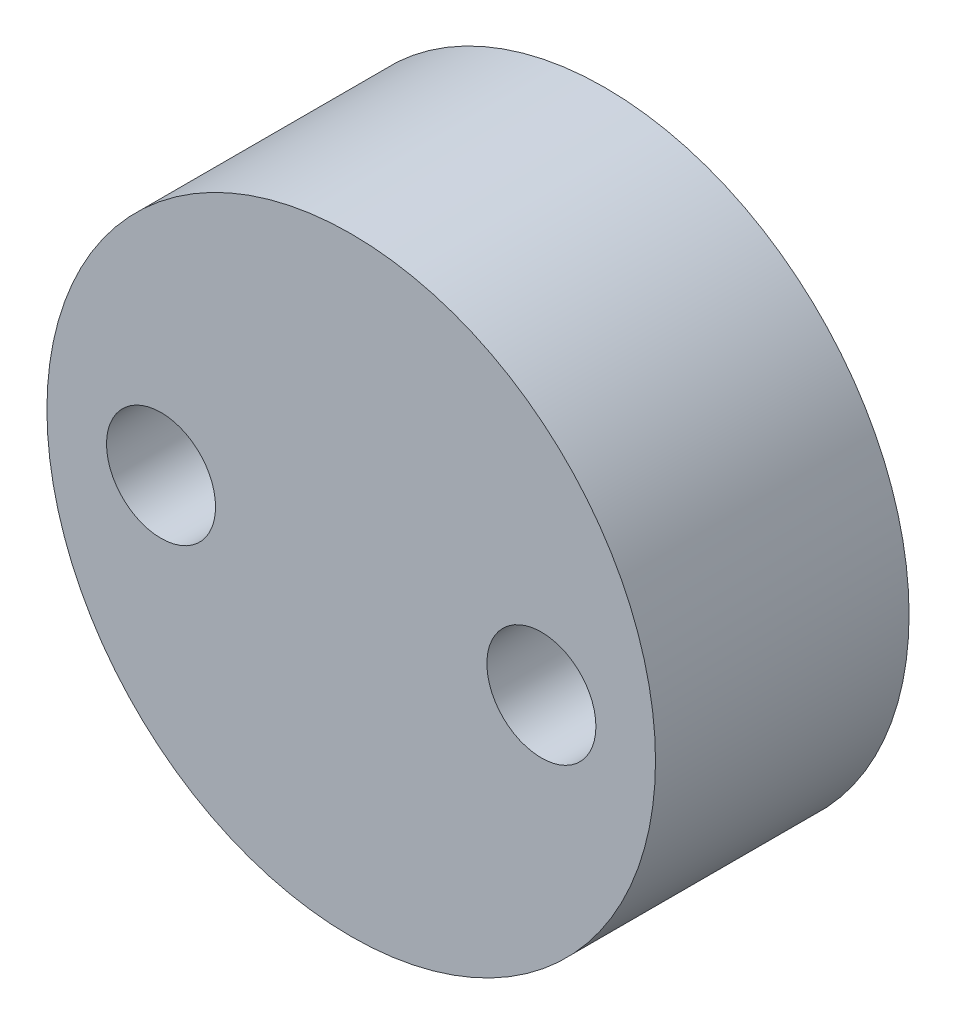
ISO-10303-21;
HEADER;
FILE_DESCRIPTION(('STEP AP214'),'2;1');
FILE_NAME('part.step','',(''),(''),'','','');
FILE_SCHEMA(('AUTOMOTIVE_DESIGN { 1 0 10303 214 1 1 1 1 }'));
ENDSEC;
DATA;
#1=APPLICATION_CONTEXT('core data for automotive mechanical design processes');
#2=APPLICATION_PROTOCOL_DEFINITION('international standard','automotive_design',2000,#1);
#3=PRODUCT_CONTEXT('',#1,'mechanical');
#4=PRODUCT('Part','Part','',(#3));
#5=PRODUCT_RELATED_PRODUCT_CATEGORY('part','',(#4));
#6=PRODUCT_DEFINITION_FORMATION('','',#4);
#7=PRODUCT_DEFINITION_CONTEXT('part definition',#1,'design');
#8=PRODUCT_DEFINITION('design','',#6,#7);
#9=PRODUCT_DEFINITION_SHAPE('','',#8);
#10=(LENGTH_UNIT() NAMED_UNIT(*) SI_UNIT(.MILLI.,.METRE.));
#11=(NAMED_UNIT(*) PLANE_ANGLE_UNIT() SI_UNIT($,.RADIAN.));
#12=(NAMED_UNIT(*) SI_UNIT($,.STERADIAN.) SOLID_ANGLE_UNIT());
#13=UNCERTAINTY_MEASURE_WITH_UNIT(LENGTH_MEASURE(1.E-05),#10,'distance_accuracy_value','');
#14=(GEOMETRIC_REPRESENTATION_CONTEXT(3) GLOBAL_UNCERTAINTY_ASSIGNED_CONTEXT((#13)) GLOBAL_UNIT_ASSIGNED_CONTEXT((#10,
#11,#12)) REPRESENTATION_CONTEXT('',''));
#15=CARTESIAN_POINT('',(0.,0.,0.));
#16=DIRECTION('',(0.,0.,1.));
#17=DIRECTION('',(1.,0.,0.));
#18=AXIS2_PLACEMENT_3D('',#15,#16,#17);
#19=CARTESIAN_POINT('',(0.,0.,10.));
#20=DIRECTION('',(0.,0.,-1.));
#21=DIRECTION('',(-1.,0.,0.));
#22=AXIS2_PLACEMENT_3D('',#19,#20,#21);
#23=CYLINDRICAL_SURFACE('',#22,12.);
#24=CARTESIAN_POINT('',(0.,0.,10.));
#25=DIRECTION('',(0.,0.,1.));
#26=DIRECTION('',(1.,0.,0.));
#27=AXIS2_PLACEMENT_3D('',#24,#25,#26);
#28=CIRCLE('',#27,12.);
#29=CARTESIAN_POINT('',(12.,0.,10.));
#30=VERTEX_POINT('',#29);
#31=EDGE_CURVE('E10',#30,#30,#28,.T.);
#32=ORIENTED_EDGE('',*,*,#31,.F.);
#33=EDGE_LOOP('',(#32));
#34=FACE_BOUND('',#33,.T.);
#35=CARTESIAN_POINT('',(0.,0.,0.));
#36=DIRECTION('',(0.,0.,1.));
#37=DIRECTION('',(1.,0.,0.));
#38=AXIS2_PLACEMENT_3D('',#35,#36,#37);
#39=CIRCLE('',#38,12.);
#40=CARTESIAN_POINT('',(12.,0.,0.));
#41=VERTEX_POINT('',#40);
#42=EDGE_CURVE('E34',#41,#41,#39,.T.);
#43=ORIENTED_EDGE('',*,*,#42,.T.);
#44=EDGE_LOOP('',(#43));
#45=FACE_BOUND('',#44,.T.);
#46=ADVANCED_FACE('F31',(#34,#45),#23,.T.);
#47=CARTESIAN_POINT('',(0.,0.,10.));
#48=DIRECTION('',(0.,0.,1.));
#49=DIRECTION('',(1.,0.,0.));
#50=AXIS2_PLACEMENT_3D('',#47,#48,#49);
#51=PLANE('',#50);
#52=CARTESIAN_POINT('',(7.5,0.,10.));
#53=DIRECTION('',(0.,0.,1.));
#54=DIRECTION('',(1.,0.,0.));
#55=AXIS2_PLACEMENT_3D('',#52,#53,#54);
#56=CIRCLE('',#55,2.15);
#57=CARTESIAN_POINT('',(9.65,0.,10.));
#58=VERTEX_POINT('',#57);
#59=EDGE_CURVE('E46',#58,#58,#56,.T.);
#60=ORIENTED_EDGE('',*,*,#59,.F.);
#61=EDGE_LOOP('',(#60));
#62=FACE_BOUND('',#61,.T.);
#63=CARTESIAN_POINT('',(-7.5,0.,10.));
#64=DIRECTION('',(0.,0.,1.));
#65=DIRECTION('',(-1.,0.,0.));
#66=AXIS2_PLACEMENT_3D('',#63,#64,#65);
#67=CIRCLE('',#66,2.15);
#68=CARTESIAN_POINT('',(-9.65,0.,10.));
#69=VERTEX_POINT('',#68);
#70=EDGE_CURVE('E47',#69,#69,#67,.T.);
#71=ORIENTED_EDGE('',*,*,#70,.F.);
#72=EDGE_LOOP('',(#71));
#73=FACE_BOUND('',#72,.T.);
#74=ORIENTED_EDGE('',*,*,#31,.T.);
#75=EDGE_LOOP('',(#74));
#76=FACE_BOUND('',#75,.T.);
#77=ADVANCED_FACE('F57',(#62,#73,#76),#51,.T.);
#78=CARTESIAN_POINT('',(0.,0.,0.));
#79=DIRECTION('',(0.,0.,1.));
#80=DIRECTION('',(1.,0.,0.));
#81=AXIS2_PLACEMENT_3D('',#78,#79,#80);
#82=PLANE('',#81);
#83=CARTESIAN_POINT('',(7.5,0.,0.));
#84=DIRECTION('',(0.,0.,1.));
#85=DIRECTION('',(1.,0.,0.));
#86=AXIS2_PLACEMENT_3D('',#83,#84,#85);
#87=CIRCLE('',#86,2.15);
#88=CARTESIAN_POINT('',(9.65,0.,0.));
#89=VERTEX_POINT('',#88);
#90=EDGE_CURVE('E41',#89,#89,#87,.F.);
#91=ORIENTED_EDGE('',*,*,#90,.F.);
#92=EDGE_LOOP('',(#91));
#93=FACE_BOUND('',#92,.T.);
#94=CARTESIAN_POINT('',(-7.5,0.,0.));
#95=DIRECTION('',(0.,0.,1.));
#96=DIRECTION('',(1.,0.,0.));
#97=AXIS2_PLACEMENT_3D('',#94,#95,#96);
#98=CIRCLE('',#97,2.15);
#99=CARTESIAN_POINT('',(-5.35,0.,0.));
#100=VERTEX_POINT('',#99);
#101=EDGE_CURVE('E43',#100,#100,#98,.F.);
#102=ORIENTED_EDGE('',*,*,#101,.F.);
#103=EDGE_LOOP('',(#102));
#104=FACE_BOUND('',#103,.T.);
#105=ORIENTED_EDGE('',*,*,#42,.F.);
#106=EDGE_LOOP('',(#105));
#107=FACE_BOUND('',#106,.T.);
#108=ADVANCED_FACE('F60',(#93,#104,#107),#82,.F.);
#109=CARTESIAN_POINT('',(-7.5,0.,-6.08111831820431));
#110=DIRECTION('',(0.,0.,1.));
#111=DIRECTION('',(1.,0.,0.));
#112=AXIS2_PLACEMENT_3D('',#109,#110,#111);
#113=CYLINDRICAL_SURFACE('',#112,2.15);
#114=ORIENTED_EDGE('',*,*,#101,.T.);
#115=EDGE_LOOP('',(#114));
#116=FACE_BOUND('',#115,.T.);
#117=ORIENTED_EDGE('',*,*,#70,.T.);
#118=EDGE_LOOP('',(#117));
#119=FACE_BOUND('',#118,.T.);
#120=ADVANCED_FACE('F64',(#116,#119),#113,.F.);
#121=CARTESIAN_POINT('',(7.5,0.,-6.08111831820431));
#122=DIRECTION('',(0.,0.,1.));
#123=DIRECTION('',(1.,0.,0.));
#124=AXIS2_PLACEMENT_3D('',#121,#122,#123);
#125=CYLINDRICAL_SURFACE('',#124,2.15);
#126=ORIENTED_EDGE('',*,*,#90,.T.);
#127=EDGE_LOOP('',(#126));
#128=FACE_BOUND('',#127,.T.);
#129=ORIENTED_EDGE('',*,*,#59,.T.);
#130=EDGE_LOOP('',(#129));
#131=FACE_BOUND('',#130,.T.);
#132=ADVANCED_FACE('F55',(#128,#131),#125,.F.);
#133=CLOSED_SHELL('',(#46,#77,#108,#120,#132));
#134=MANIFOLD_SOLID_BREP('B2',#133);
#135=ADVANCED_BREP_SHAPE_REPRESENTATION('',(#18,#134),#14);
#136=SHAPE_DEFINITION_REPRESENTATION(#9,#135);
ENDSEC;
END-ISO-10303-21;
